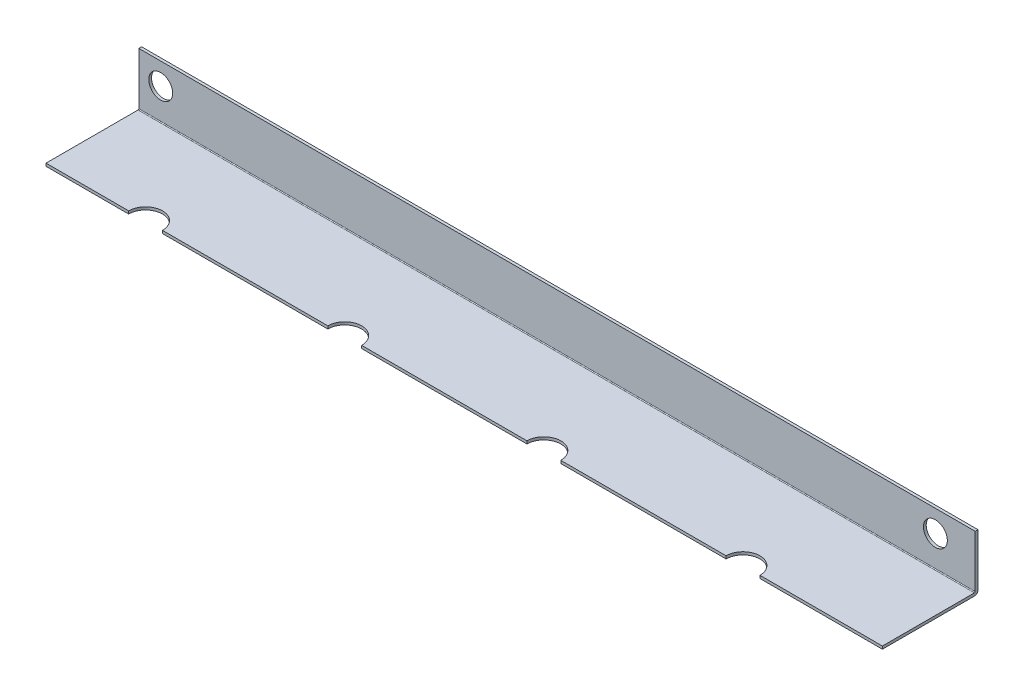
ISO-10303-21;
HEADER;
FILE_DESCRIPTION(('STEP AP214'),'2;1');
FILE_NAME('part.step','',(''),(''),'','','');
FILE_SCHEMA(('AUTOMOTIVE_DESIGN { 1 0 10303 214 1 1 1 1 }'));
ENDSEC;
DATA;
#1=APPLICATION_CONTEXT('core data for automotive mechanical design processes');
#2=APPLICATION_PROTOCOL_DEFINITION('international standard','automotive_design',2000,#1);
#3=PRODUCT_CONTEXT('',#1,'mechanical');
#4=PRODUCT('Part','Part','',(#3));
#5=PRODUCT_RELATED_PRODUCT_CATEGORY('part','',(#4));
#6=PRODUCT_DEFINITION_FORMATION('','',#4);
#7=PRODUCT_DEFINITION_CONTEXT('part definition',#1,'design');
#8=PRODUCT_DEFINITION('design','',#6,#7);
#9=PRODUCT_DEFINITION_SHAPE('','',#8);
#10=(LENGTH_UNIT() NAMED_UNIT(*) SI_UNIT(.MILLI.,.METRE.));
#11=(NAMED_UNIT(*) PLANE_ANGLE_UNIT() SI_UNIT($,.RADIAN.));
#12=(NAMED_UNIT(*) SI_UNIT($,.STERADIAN.) SOLID_ANGLE_UNIT());
#13=UNCERTAINTY_MEASURE_WITH_UNIT(LENGTH_MEASURE(1.E-05),#10,'distance_accuracy_value','');
#14=(GEOMETRIC_REPRESENTATION_CONTEXT(3) GLOBAL_UNCERTAINTY_ASSIGNED_CONTEXT((#13)) GLOBAL_UNIT_ASSIGNED_CONTEXT((#10,
#11,#12)) REPRESENTATION_CONTEXT('',''));
#15=CARTESIAN_POINT('',(0.,0.,0.));
#16=DIRECTION('',(0.,0.,1.));
#17=DIRECTION('',(1.,0.,0.));
#18=AXIS2_PLACEMENT_3D('',#15,#16,#17);
#19=CARTESIAN_POINT('',(-200.,13.31,-47.9999999999996));
#20=DIRECTION('',(0.,0.,-1.));
#21=DIRECTION('',(-1.,0.,0.));
#22=AXIS2_PLACEMENT_3D('',#19,#20,#21);
#23=PLANE('',#22);
#24=DIRECTION('',(-1.,0.,0.));
#25=VECTOR('',#24,1.);
#26=CARTESIAN_POINT('',(0.,0.,-47.9999999999996));
#27=LINE('',#26,#25);
#28=CARTESIAN_POINT('',(-179.25,0.,-47.9999999999996));
#29=VERTEX_POINT('',#28);
#30=CARTESIAN_POINT('',(-200.,0.,-47.9999999999996));
#31=VERTEX_POINT('',#30);
#32=EDGE_CURVE('E220',#29,#31,#27,.T.);
#33=ORIENTED_EDGE('',*,*,#32,.T.);
#34=DIRECTION('',(0.,-1.,0.));
#35=VECTOR('',#34,1.);
#36=CARTESIAN_POINT('',(-200.,-0.7,-47.9999999999996));
#37=LINE('',#36,#35);
#38=CARTESIAN_POINT('',(-200.,-0.7,-47.9999999999996));
#39=VERTEX_POINT('',#38);
#40=EDGE_CURVE('E174',#31,#39,#37,.T.);
#41=ORIENTED_EDGE('',*,*,#40,.T.);
#42=DIRECTION('',(-1.,0.,0.));
#43=VECTOR('',#42,1.);
#44=CARTESIAN_POINT('',(0.,-0.7,-47.9999999999996));
#45=LINE('',#44,#43);
#46=CARTESIAN_POINT('',(-179.25,-0.7,-47.9999999999996));
#47=VERTEX_POINT('',#46);
#48=EDGE_CURVE('E224',#47,#39,#45,.T.);
#49=ORIENTED_EDGE('',*,*,#48,.F.);
#50=DIRECTION('',(0.,1.,0.));
#51=VECTOR('',#50,1.);
#52=CARTESIAN_POINT('',(-179.25,-0.7,-47.9999999999996));
#53=LINE('',#52,#51);
#54=EDGE_CURVE('E225',#29,#47,#53,.F.);
#55=ORIENTED_EDGE('',*,*,#54,.F.);
#56=EDGE_LOOP('',(#33,#41,#49,#55));
#57=FACE_BOUND('',#56,.T.);
#58=ADVANCED_FACE('F36',(#57),#23,.F.);
#59=CARTESIAN_POINT('',(-129.25,-0.7,-47.9999999999996));
#60=VERTEX_POINT('',#59);
#61=CARTESIAN_POINT('',(-170.75,-0.7,-47.9999999999996));
#62=VERTEX_POINT('',#61);
#63=EDGE_CURVE('E310',#60,#62,#45,.T.);
#64=ORIENTED_EDGE('',*,*,#63,.F.);
#65=DIRECTION('',(0.,1.,0.));
#66=VECTOR('',#65,1.);
#67=CARTESIAN_POINT('',(-129.25,-0.7,-47.9999999999996));
#68=LINE('',#67,#66);
#69=CARTESIAN_POINT('',(-129.25,0.,-47.9999999999996));
#70=VERTEX_POINT('',#69);
#71=EDGE_CURVE('E229',#70,#60,#68,.F.);
#72=ORIENTED_EDGE('',*,*,#71,.F.);
#73=CARTESIAN_POINT('',(-170.75,0.,-47.9999999999996));
#74=VERTEX_POINT('',#73);
#75=EDGE_CURVE('E325',#70,#74,#27,.T.);
#76=ORIENTED_EDGE('',*,*,#75,.T.);
#77=DIRECTION('',(0.,1.,0.));
#78=VECTOR('',#77,1.);
#79=CARTESIAN_POINT('',(-170.75,-0.7,-47.9999999999996));
#80=LINE('',#79,#78);
#81=EDGE_CURVE('E227',#62,#74,#80,.T.);
#82=ORIENTED_EDGE('',*,*,#81,.F.);
#83=EDGE_LOOP('',(#64,#72,#76,#82));
#84=FACE_BOUND('',#83,.T.);
#85=ADVANCED_FACE('F337',(#84),#23,.F.);
#86=CARTESIAN_POINT('',(-79.2500000000001,-0.7,-47.9999999999996));
#87=VERTEX_POINT('',#86);
#88=CARTESIAN_POINT('',(-120.75,-0.7,-47.9999999999996));
#89=VERTEX_POINT('',#88);
#90=EDGE_CURVE('E308',#87,#89,#45,.T.);
#91=ORIENTED_EDGE('',*,*,#90,.F.);
#92=DIRECTION('',(0.,1.,0.));
#93=VECTOR('',#92,1.);
#94=CARTESIAN_POINT('',(-79.2500000000001,-0.7,-47.9999999999996));
#95=LINE('',#94,#93);
#96=CARTESIAN_POINT('',(-79.2500000000001,0.,-47.9999999999996));
#97=VERTEX_POINT('',#96);
#98=EDGE_CURVE('E237',#97,#87,#95,.F.);
#99=ORIENTED_EDGE('',*,*,#98,.F.);
#100=CARTESIAN_POINT('',(-120.75,0.,-47.9999999999996));
#101=VERTEX_POINT('',#100);
#102=EDGE_CURVE('E326',#97,#101,#27,.T.);
#103=ORIENTED_EDGE('',*,*,#102,.T.);
#104=DIRECTION('',(0.,1.,0.));
#105=VECTOR('',#104,1.);
#106=CARTESIAN_POINT('',(-120.75,-0.7,-47.9999999999996));
#107=LINE('',#106,#105);
#108=EDGE_CURVE('E231',#89,#101,#107,.T.);
#109=ORIENTED_EDGE('',*,*,#108,.F.);
#110=EDGE_LOOP('',(#91,#99,#103,#109));
#111=FACE_BOUND('',#110,.T.);
#112=ADVANCED_FACE('F334',(#111),#23,.F.);
#113=CARTESIAN_POINT('',(-29.2500000000001,0.,-47.9999999999996));
#114=VERTEX_POINT('',#113);
#115=CARTESIAN_POINT('',(-70.7500000000001,0.,-47.9999999999996));
#116=VERTEX_POINT('',#115);
#117=EDGE_CURVE('E181',#114,#116,#27,.T.);
#118=ORIENTED_EDGE('',*,*,#117,.T.);
#119=DIRECTION('',(0.,1.,0.));
#120=VECTOR('',#119,1.);
#121=CARTESIAN_POINT('',(-70.7500000000001,-0.7,-47.9999999999996));
#122=LINE('',#121,#120);
#123=CARTESIAN_POINT('',(-70.7500000000001,-0.7,-47.9999999999996));
#124=VERTEX_POINT('',#123);
#125=EDGE_CURVE('E239',#124,#116,#122,.T.);
#126=ORIENTED_EDGE('',*,*,#125,.F.);
#127=CARTESIAN_POINT('',(-29.2500000000001,-0.7,-47.9999999999996));
#128=VERTEX_POINT('',#127);
#129=EDGE_CURVE('E180',#128,#124,#45,.T.);
#130=ORIENTED_EDGE('',*,*,#129,.F.);
#131=DIRECTION('',(0.,1.,0.));
#132=VECTOR('',#131,1.);
#133=CARTESIAN_POINT('',(-29.2500000000001,-0.7,-47.9999999999996));
#134=LINE('',#133,#132);
#135=EDGE_CURVE('E233',#114,#128,#134,.F.);
#136=ORIENTED_EDGE('',*,*,#135,.F.);
#137=EDGE_LOOP('',(#118,#126,#130,#136));
#138=FACE_BOUND('',#137,.T.);
#139=ADVANCED_FACE('F306',(#138),#23,.F.);
#140=CARTESIAN_POINT('',(9.9999999999999,0.,-47.9999999999996));
#141=VERTEX_POINT('',#140);
#142=CARTESIAN_POINT('',(-20.75,0.,-47.9999999999996));
#143=VERTEX_POINT('',#142);
#144=EDGE_CURVE('E217',#141,#143,#27,.T.);
#145=ORIENTED_EDGE('',*,*,#144,.T.);
#146=DIRECTION('',(0.,1.,0.));
#147=VECTOR('',#146,1.);
#148=CARTESIAN_POINT('',(-20.75,-0.7,-47.9999999999996));
#149=LINE('',#148,#147);
#150=CARTESIAN_POINT('',(-20.75,-0.7,-47.9999999999996));
#151=VERTEX_POINT('',#150);
#152=EDGE_CURVE('E235',#151,#143,#149,.T.);
#153=ORIENTED_EDGE('',*,*,#152,.F.);
#154=CARTESIAN_POINT('',(9.9999999999999,-0.7,-47.9999999999996));
#155=VERTEX_POINT('',#154);
#156=EDGE_CURVE('E221',#155,#151,#45,.T.);
#157=ORIENTED_EDGE('',*,*,#156,.F.);
#158=DIRECTION('',(0.,-1.,0.));
#159=VECTOR('',#158,1.);
#160=CARTESIAN_POINT('',(9.9999999999999,13.31,-47.9999999999996));
#161=LINE('',#160,#159);
#162=EDGE_CURVE('E11',#141,#155,#161,.T.);
#163=ORIENTED_EDGE('',*,*,#162,.F.);
#164=EDGE_LOOP('',(#145,#153,#157,#163));
#165=FACE_BOUND('',#164,.T.);
#166=ADVANCED_FACE('F298',(#165),#23,.F.);
#167=CARTESIAN_POINT('',(9.9999999999999,13.31,-72.));
#168=DIRECTION('',(1.,0.,0.));
#169=DIRECTION('',(0.,0.,-1.));
#170=AXIS2_PLACEMENT_3D('',#167,#168,#169);
#171=PLANE('',#170);
#172=CARTESIAN_POINT('',(9.9999999999999,0.200000000000011,-71.1));
#173=DIRECTION('',(1.,0.,0.));
#174=DIRECTION('',(0.,0.,-1.));
#175=AXIS2_PLACEMENT_3D('',#172,#173,#174);
#176=CIRCLE('',#175,0.900000000000006);
#177=CARTESIAN_POINT('',(9.9999999999999,0.200000000000017,-72.));
#178=VERTEX_POINT('',#177);
#179=CARTESIAN_POINT('',(9.9999999999999,-0.699999999999995,-71.1));
#180=VERTEX_POINT('',#179);
#181=EDGE_CURVE('E166',#178,#180,#176,.F.);
#182=ORIENTED_EDGE('',*,*,#181,.F.);
#183=DIRECTION('',(0.,1.,0.));
#184=VECTOR('',#183,1.);
#185=CARTESIAN_POINT('',(9.9999999999999,-2.27827658477636E-13,-72.));
#186=LINE('',#185,#184);
#187=CARTESIAN_POINT('',(9.9999999999999,13.3,-72.0000000000001));
#188=VERTEX_POINT('',#187);
#189=EDGE_CURVE('E172',#178,#188,#186,.T.);
#190=ORIENTED_EDGE('',*,*,#189,.T.);
#191=DIRECTION('',(0.,0.,1.));
#192=VECTOR('',#191,1.);
#193=CARTESIAN_POINT('',(9.9999999999999,13.3,-72.));
#194=LINE('',#193,#192);
#195=CARTESIAN_POINT('',(9.9999999999999,13.3,-71.3));
#196=VERTEX_POINT('',#195);
#197=EDGE_CURVE('E40',#188,#196,#194,.T.);
#198=ORIENTED_EDGE('',*,*,#197,.T.);
#199=DIRECTION('',(0.,1.,0.));
#200=VECTOR('',#199,1.);
#201=CARTESIAN_POINT('',(9.9999999999999,-2.25383621540445E-13,-71.3));
#202=LINE('',#201,#200);
#203=CARTESIAN_POINT('',(9.9999999999999,0.200000000000012,-71.3));
#204=VERTEX_POINT('',#203);
#205=EDGE_CURVE('E159',#204,#196,#202,.T.);
#206=ORIENTED_EDGE('',*,*,#205,.F.);
#207=CARTESIAN_POINT('',(9.9999999999999,0.200000000000011,-71.1));
#208=DIRECTION('',(1.,0.,0.));
#209=DIRECTION('',(0.,0.,-1.));
#210=AXIS2_PLACEMENT_3D('',#207,#208,#209);
#211=CIRCLE('',#210,0.200000000000006);
#212=CARTESIAN_POINT('',(9.9999999999999,0.,-71.1));
#213=VERTEX_POINT('',#212);
#214=EDGE_CURVE('E173',#204,#213,#211,.F.);
#215=ORIENTED_EDGE('',*,*,#214,.T.);
#216=DIRECTION('',(0.,0.,-1.));
#217=VECTOR('',#216,1.);
#218=CARTESIAN_POINT('',(9.99999999999991,0.,0.));
#219=LINE('',#218,#217);
#220=EDGE_CURVE('E223',#141,#213,#219,.T.);
#221=ORIENTED_EDGE('',*,*,#220,.F.);
#222=ORIENTED_EDGE('',*,*,#162,.T.);
#223=DIRECTION('',(0.,0.,-1.));
#224=VECTOR('',#223,1.);
#225=CARTESIAN_POINT('',(9.99999999999991,-0.7,0.));
#226=LINE('',#225,#224);
#227=EDGE_CURVE('E177',#155,#180,#226,.T.);
#228=ORIENTED_EDGE('',*,*,#227,.T.);
#229=EDGE_LOOP('',(#182,#190,#198,#206,#215,#221,#222,#228));
#230=FACE_BOUND('',#229,.T.);
#231=ADVANCED_FACE('F170',(#230),#171,.T.);
#232=CARTESIAN_POINT('',(0.,-0.7,0.));
#233=DIRECTION('',(0.,1.,0.));
#234=DIRECTION('',(0.,0.,1.));
#235=AXIS2_PLACEMENT_3D('',#232,#233,#234);
#236=PLANE('',#235);
#237=CARTESIAN_POINT('',(-25.,-0.7,-48.));
#238=DIRECTION('',(0.,1.,0.));
#239=DIRECTION('',(0.,0.,-1.));
#240=AXIS2_PLACEMENT_3D('',#237,#238,#239);
#241=CIRCLE('',#240,4.25000000000001);
#242=EDGE_CURVE('E195',#151,#128,#241,.T.);
#243=ORIENTED_EDGE('',*,*,#242,.T.);
#244=ORIENTED_EDGE('',*,*,#129,.T.);
#245=CARTESIAN_POINT('',(-75.0000000000001,-0.7,-48.));
#246=DIRECTION('',(0.,1.,0.));
#247=DIRECTION('',(0.,0.,1.));
#248=AXIS2_PLACEMENT_3D('',#245,#246,#247);
#249=CIRCLE('',#248,4.25000000000001);
#250=EDGE_CURVE('E189',#124,#87,#249,.T.);
#251=ORIENTED_EDGE('',*,*,#250,.T.);
#252=ORIENTED_EDGE('',*,*,#90,.T.);
#253=CARTESIAN_POINT('',(-125.,-0.7,-48.));
#254=DIRECTION('',(0.,1.,0.));
#255=DIRECTION('',(0.,0.,-1.));
#256=AXIS2_PLACEMENT_3D('',#253,#254,#255);
#257=CIRCLE('',#256,4.25000000000001);
#258=EDGE_CURVE('E201',#89,#60,#257,.T.);
#259=ORIENTED_EDGE('',*,*,#258,.T.);
#260=ORIENTED_EDGE('',*,*,#63,.T.);
#261=CARTESIAN_POINT('',(-175.,-0.7,-48.));
#262=DIRECTION('',(0.,1.,0.));
#263=DIRECTION('',(0.,0.,1.));
#264=AXIS2_PLACEMENT_3D('',#261,#262,#263);
#265=CIRCLE('',#264,4.25000000000001);
#266=EDGE_CURVE('E207',#62,#47,#265,.T.);
#267=ORIENTED_EDGE('',*,*,#266,.T.);
#268=ORIENTED_EDGE('',*,*,#48,.T.);
#269=DIRECTION('',(0.,0.,1.));
#270=VECTOR('',#269,1.);
#271=CARTESIAN_POINT('',(-200.,-0.7,-72.));
#272=LINE('',#271,#270);
#273=CARTESIAN_POINT('',(-200.,-0.699999999999981,-71.1));
#274=VERTEX_POINT('',#273);
#275=EDGE_CURVE('E165',#274,#39,#272,.T.);
#276=ORIENTED_EDGE('',*,*,#275,.F.);
#277=DIRECTION('',(-1.,0.,0.));
#278=VECTOR('',#277,1.);
#279=CARTESIAN_POINT('',(-200.,-0.699999999999981,-71.1));
#280=LINE('',#279,#278);
#281=EDGE_CURVE('E257',#274,#180,#280,.F.);
#282=ORIENTED_EDGE('',*,*,#281,.T.);
#283=ORIENTED_EDGE('',*,*,#227,.F.);
#284=ORIENTED_EDGE('',*,*,#156,.T.);
#285=EDGE_LOOP('',(#243,#244,#251,#252,#259,#260,#267,#268,#276,#282,#283,#284));
#286=FACE_BOUND('',#285,.T.);
#287=ADVANCED_FACE('F279',(#286),#236,.F.);
#288=CARTESIAN_POINT('',(0.,0.,0.));
#289=DIRECTION('',(0.,1.,0.));
#290=DIRECTION('',(0.,0.,1.));
#291=AXIS2_PLACEMENT_3D('',#288,#289,#290);
#292=PLANE('',#291);
#293=ORIENTED_EDGE('',*,*,#117,.F.);
#294=CARTESIAN_POINT('',(-25.,0.,-48.));
#295=DIRECTION('',(0.,1.,0.));
#296=DIRECTION('',(0.,0.,-1.));
#297=AXIS2_PLACEMENT_3D('',#294,#295,#296);
#298=CIRCLE('',#297,4.25000000000001);
#299=EDGE_CURVE('E192',#143,#114,#298,.T.);
#300=ORIENTED_EDGE('',*,*,#299,.F.);
#301=ORIENTED_EDGE('',*,*,#144,.F.);
#302=ORIENTED_EDGE('',*,*,#220,.T.);
#303=DIRECTION('',(-1.,0.,0.));
#304=VECTOR('',#303,1.);
#305=CARTESIAN_POINT('',(-200.,0.,-71.1));
#306=LINE('',#305,#304);
#307=CARTESIAN_POINT('',(-200.,0.,-71.1));
#308=VERTEX_POINT('',#307);
#309=EDGE_CURVE('E261',#308,#213,#306,.F.);
#310=ORIENTED_EDGE('',*,*,#309,.F.);
#311=DIRECTION('',(0.,0.,1.));
#312=VECTOR('',#311,1.);
#313=CARTESIAN_POINT('',(-200.,0.,-72.));
#314=LINE('',#313,#312);
#315=EDGE_CURVE('E210',#308,#31,#314,.T.);
#316=ORIENTED_EDGE('',*,*,#315,.T.);
#317=ORIENTED_EDGE('',*,*,#32,.F.);
#318=CARTESIAN_POINT('',(-175.,0.,-48.));
#319=DIRECTION('',(0.,1.,0.));
#320=DIRECTION('',(0.,0.,1.));
#321=AXIS2_PLACEMENT_3D('',#318,#319,#320);
#322=CIRCLE('',#321,4.25000000000001);
#323=EDGE_CURVE('E204',#74,#29,#322,.T.);
#324=ORIENTED_EDGE('',*,*,#323,.F.);
#325=ORIENTED_EDGE('',*,*,#75,.F.);
#326=CARTESIAN_POINT('',(-125.,0.,-48.));
#327=DIRECTION('',(0.,1.,0.));
#328=DIRECTION('',(0.,0.,-1.));
#329=AXIS2_PLACEMENT_3D('',#326,#327,#328);
#330=CIRCLE('',#329,4.25000000000001);
#331=EDGE_CURVE('E198',#101,#70,#330,.T.);
#332=ORIENTED_EDGE('',*,*,#331,.F.);
#333=ORIENTED_EDGE('',*,*,#102,.F.);
#334=CARTESIAN_POINT('',(-75.0000000000001,0.,-48.));
#335=DIRECTION('',(0.,1.,0.));
#336=DIRECTION('',(0.,0.,1.));
#337=AXIS2_PLACEMENT_3D('',#334,#335,#336);
#338=CIRCLE('',#337,4.25000000000001);
#339=EDGE_CURVE('E185',#116,#97,#338,.T.);
#340=ORIENTED_EDGE('',*,*,#339,.F.);
#341=EDGE_LOOP('',(#293,#300,#301,#302,#310,#316,#317,#324,#325,#332,#333,#340));
#342=FACE_BOUND('',#341,.T.);
#343=ADVANCED_FACE('F294',(#342),#292,.T.);
#344=CARTESIAN_POINT('',(-200.,0.200000000000025,-71.1));
#345=DIRECTION('',(1.,0.,0.));
#346=DIRECTION('',(0.,1.,0.));
#347=AXIS2_PLACEMENT_3D('',#344,#345,#346);
#348=PLANE('',#347);
#349=CARTESIAN_POINT('',(-200.,0.200000000000025,-71.1));
#350=DIRECTION('',(-1.,0.,0.));
#351=DIRECTION('',(0.,-1.,0.));
#352=AXIS2_PLACEMENT_3D('',#349,#350,#351);
#353=CIRCLE('',#352,0.200000000000006);
#354=CARTESIAN_POINT('',(-200.,0.200000000000024,-71.3));
#355=VERTEX_POINT('',#354);
#356=EDGE_CURVE('E249',#355,#308,#353,.T.);
#357=ORIENTED_EDGE('',*,*,#356,.F.);
#358=DIRECTION('',(0.,0.,1.));
#359=VECTOR('',#358,1.);
#360=CARTESIAN_POINT('',(-200.,0.20000000000002,-71.3));
#361=LINE('',#360,#359);
#362=CARTESIAN_POINT('',(-200.,0.200000000000024,-72.));
#363=VERTEX_POINT('',#362);
#364=EDGE_CURVE('E184',#355,#363,#361,.F.);
#365=ORIENTED_EDGE('',*,*,#364,.T.);
#366=CARTESIAN_POINT('',(-200.,0.200000000000025,-71.1));
#367=DIRECTION('',(-1.,0.,0.));
#368=DIRECTION('',(0.,-1.,0.));
#369=AXIS2_PLACEMENT_3D('',#366,#367,#368);
#370=CIRCLE('',#369,0.900000000000006);
#371=EDGE_CURVE('E55',#363,#274,#370,.T.);
#372=ORIENTED_EDGE('',*,*,#371,.T.);
#373=DIRECTION('',(0.,-1.,0.));
#374=VECTOR('',#373,1.);
#375=CARTESIAN_POINT('',(-200.,0.,-71.1));
#376=LINE('',#375,#374);
#377=EDGE_CURVE('E188',#308,#274,#376,.T.);
#378=ORIENTED_EDGE('',*,*,#377,.F.);
#379=EDGE_LOOP('',(#357,#365,#372,#378));
#380=FACE_BOUND('',#379,.T.);
#381=ADVANCED_FACE('F287',(#380),#348,.F.);
#382=CARTESIAN_POINT('',(-200.,0.200000000000025,-71.1));
#383=DIRECTION('',(-1.,0.,0.));
#384=DIRECTION('',(0.,0.,-1.));
#385=AXIS2_PLACEMENT_3D('',#382,#383,#384);
#386=CYLINDRICAL_SURFACE('',#385,0.900000000000006);
#387=DIRECTION('',(-1.,0.,0.));
#388=VECTOR('',#387,1.);
#389=CARTESIAN_POINT('',(200.,0.200000000000011,-72.));
#390=LINE('',#389,#388);
#391=EDGE_CURVE('E254',#363,#178,#390,.F.);
#392=ORIENTED_EDGE('',*,*,#391,.T.);
#393=ORIENTED_EDGE('',*,*,#181,.T.);
#394=ORIENTED_EDGE('',*,*,#281,.F.);
#395=ORIENTED_EDGE('',*,*,#371,.F.);
#396=EDGE_LOOP('',(#392,#393,#394,#395));
#397=FACE_BOUND('',#396,.T.);
#398=ADVANCED_FACE('F273',(#397),#386,.T.);
#399=CARTESIAN_POINT('',(-200.,0.200000000000025,-71.1));
#400=DIRECTION('',(-1.,0.,0.));
#401=DIRECTION('',(0.,0.,-1.));
#402=AXIS2_PLACEMENT_3D('',#399,#400,#401);
#403=CYLINDRICAL_SURFACE('',#402,0.200000000000006);
#404=ORIENTED_EDGE('',*,*,#214,.F.);
#405=DIRECTION('',(-1.,0.,0.));
#406=VECTOR('',#405,1.);
#407=CARTESIAN_POINT('',(200.,0.200000000000006,-71.3));
#408=LINE('',#407,#406);
#409=EDGE_CURVE('E161',#204,#355,#408,.T.);
#410=ORIENTED_EDGE('',*,*,#409,.T.);
#411=ORIENTED_EDGE('',*,*,#356,.T.);
#412=ORIENTED_EDGE('',*,*,#309,.T.);
#413=EDGE_LOOP('',(#404,#410,#411,#412));
#414=FACE_BOUND('',#413,.T.);
#415=ADVANCED_FACE('F290',(#414),#403,.F.);
#416=CARTESIAN_POINT('',(0.,7.80000000000007,-62.));
#417=DIRECTION('',(0.,0.,-1.));
#418=DIRECTION('',(0.,1.,0.));
#419=AXIS2_PLACEMENT_3D('',#416,#417,#418);
#420=CYLINDRICAL_SURFACE('',#419,3.);
#421=CARTESIAN_POINT('',(0.,7.80000000000004,-71.3));
#422=DIRECTION('',(0.,0.,1.));
#423=DIRECTION('',(0.,-1.,0.));
#424=AXIS2_PLACEMENT_3D('',#421,#422,#423);
#425=CIRCLE('',#424,3.);
#426=CARTESIAN_POINT('',(0.,4.80000000000004,-71.3));
#427=VERTEX_POINT('',#426);
#428=EDGE_CURVE('E183',#427,#427,#425,.T.);
#429=ORIENTED_EDGE('',*,*,#428,.T.);
#430=EDGE_LOOP('',(#429));
#431=FACE_BOUND('',#430,.T.);
#432=CARTESIAN_POINT('',(0.,7.80000000000004,-72.));
#433=DIRECTION('',(0.,0.,-1.));
#434=DIRECTION('',(0.,1.,0.));
#435=AXIS2_PLACEMENT_3D('',#432,#433,#434);
#436=CIRCLE('',#435,3.);
#437=CARTESIAN_POINT('',(0.,10.8,-72.0000000000001));
#438=VERTEX_POINT('',#437);
#439=EDGE_CURVE('E241',#438,#438,#436,.T.);
#440=ORIENTED_EDGE('',*,*,#439,.T.);
#441=EDGE_LOOP('',(#440));
#442=FACE_BOUND('',#441,.T.);
#443=ADVANCED_FACE('F473',(#431,#442),#420,.F.);
#444=CARTESIAN_POINT('',(-194.5,7.80000000000008,-62.));
#445=DIRECTION('',(0.,0.,-1.));
#446=DIRECTION('',(0.,1.,0.));
#447=AXIS2_PLACEMENT_3D('',#444,#445,#446);
#448=CYLINDRICAL_SURFACE('',#447,2.99999999999999);
#449=CARTESIAN_POINT('',(-194.5,7.80000000000005,-71.3));
#450=DIRECTION('',(0.,0.,1.));
#451=DIRECTION('',(0.,-1.,0.));
#452=AXIS2_PLACEMENT_3D('',#449,#450,#451);
#453=CIRCLE('',#452,2.99999999999999);
#454=CARTESIAN_POINT('',(-194.5,4.80000000000006,-71.3));
#455=VERTEX_POINT('',#454);
#456=EDGE_CURVE('E244',#455,#455,#453,.T.);
#457=ORIENTED_EDGE('',*,*,#456,.T.);
#458=EDGE_LOOP('',(#457));
#459=FACE_BOUND('',#458,.T.);
#460=CARTESIAN_POINT('',(-194.5,7.80000000000005,-72.));
#461=DIRECTION('',(0.,0.,-1.));
#462=DIRECTION('',(0.,-1.,0.));
#463=AXIS2_PLACEMENT_3D('',#460,#461,#462);
#464=CIRCLE('',#463,2.99999999999999);
#465=CARTESIAN_POINT('',(-194.5,4.80000000000005,-72.));
#466=VERTEX_POINT('',#465);
#467=EDGE_CURVE('E46',#466,#466,#464,.T.);
#468=ORIENTED_EDGE('',*,*,#467,.T.);
#469=EDGE_LOOP('',(#468));
#470=FACE_BOUND('',#469,.T.);
#471=ADVANCED_FACE('F462',(#459,#470),#448,.F.);
#472=CARTESIAN_POINT('',(0.,-2.25383621540445E-13,-71.3));
#473=DIRECTION('',(0.,0.,1.));
#474=DIRECTION('',(0.,-1.,0.));
#475=AXIS2_PLACEMENT_3D('',#472,#473,#474);
#476=PLANE('',#475);
#477=ORIENTED_EDGE('',*,*,#456,.F.);
#478=EDGE_LOOP('',(#477));
#479=FACE_BOUND('',#478,.T.);
#480=ORIENTED_EDGE('',*,*,#428,.F.);
#481=EDGE_LOOP('',(#480));
#482=FACE_BOUND('',#481,.T.);
#483=ORIENTED_EDGE('',*,*,#409,.F.);
#484=ORIENTED_EDGE('',*,*,#205,.T.);
#485=DIRECTION('',(-1.,0.,0.));
#486=VECTOR('',#485,1.);
#487=CARTESIAN_POINT('',(200.,13.3,-71.3));
#488=LINE('',#487,#486);
#489=CARTESIAN_POINT('',(-200.,13.3,-71.3));
#490=VERTEX_POINT('',#489);
#491=EDGE_CURVE('E147',#490,#196,#488,.F.);
#492=ORIENTED_EDGE('',*,*,#491,.F.);
#493=DIRECTION('',(0.,-1.,0.));
#494=VECTOR('',#493,1.);
#495=CARTESIAN_POINT('',(-200.,13.3,-71.3));
#496=LINE('',#495,#494);
#497=EDGE_CURVE('E155',#355,#490,#496,.F.);
#498=ORIENTED_EDGE('',*,*,#497,.F.);
#499=EDGE_LOOP('',(#483,#484,#492,#498));
#500=FACE_BOUND('',#499,.T.);
#501=ADVANCED_FACE('F160',(#479,#482,#500),#476,.T.);
#502=CARTESIAN_POINT('',(-200.,13.3,-72.0000000000001));
#503=DIRECTION('',(1.,0.,0.));
#504=DIRECTION('',(0.,0.,-1.));
#505=AXIS2_PLACEMENT_3D('',#502,#503,#504);
#506=PLANE('',#505);
#507=ORIENTED_EDGE('',*,*,#364,.F.);
#508=ORIENTED_EDGE('',*,*,#497,.T.);
#509=DIRECTION('',(0.,0.,1.));
#510=VECTOR('',#509,1.);
#511=CARTESIAN_POINT('',(-200.,13.3,-72.0000000000001));
#512=LINE('',#511,#510);
#513=CARTESIAN_POINT('',(-200.,13.3,-72.0000000000001));
#514=VERTEX_POINT('',#513);
#515=EDGE_CURVE('E152',#514,#490,#512,.T.);
#516=ORIENTED_EDGE('',*,*,#515,.F.);
#517=DIRECTION('',(0.,1.,0.));
#518=VECTOR('',#517,1.);
#519=CARTESIAN_POINT('',(-200.,-2.27827658477636E-13,-72.));
#520=LINE('',#519,#518);
#521=EDGE_CURVE('E156',#363,#514,#520,.T.);
#522=ORIENTED_EDGE('',*,*,#521,.F.);
#523=EDGE_LOOP('',(#507,#508,#516,#522));
#524=FACE_BOUND('',#523,.T.);
#525=ADVANCED_FACE('F442',(#524),#506,.F.);
#526=CARTESIAN_POINT('',(0.,-2.27827658477636E-13,-72.));
#527=DIRECTION('',(0.,0.,1.));
#528=DIRECTION('',(0.,-1.,0.));
#529=AXIS2_PLACEMENT_3D('',#526,#527,#528);
#530=PLANE('',#529);
#531=ORIENTED_EDGE('',*,*,#439,.F.);
#532=EDGE_LOOP('',(#531));
#533=FACE_BOUND('',#532,.T.);
#534=ORIENTED_EDGE('',*,*,#467,.F.);
#535=EDGE_LOOP('',(#534));
#536=FACE_BOUND('',#535,.T.);
#537=ORIENTED_EDGE('',*,*,#189,.F.);
#538=ORIENTED_EDGE('',*,*,#391,.F.);
#539=ORIENTED_EDGE('',*,*,#521,.T.);
#540=DIRECTION('',(1.,0.,0.));
#541=VECTOR('',#540,1.);
#542=CARTESIAN_POINT('',(0.,13.3,-72.0000000000001));
#543=LINE('',#542,#541);
#544=EDGE_CURVE('E248',#514,#188,#543,.T.);
#545=ORIENTED_EDGE('',*,*,#544,.T.);
#546=EDGE_LOOP('',(#537,#538,#539,#545));
#547=FACE_BOUND('',#546,.T.);
#548=ADVANCED_FACE('F433',(#533,#536,#547),#530,.F.);
#549=CARTESIAN_POINT('',(200.,13.3,-72.0000000000001));
#550=DIRECTION('',(0.,-1.,0.));
#551=DIRECTION('',(0.,0.,-1.));
#552=AXIS2_PLACEMENT_3D('',#549,#550,#551);
#553=PLANE('',#552);
#554=ORIENTED_EDGE('',*,*,#197,.F.);
#555=ORIENTED_EDGE('',*,*,#544,.F.);
#556=ORIENTED_EDGE('',*,*,#515,.T.);
#557=ORIENTED_EDGE('',*,*,#491,.T.);
#558=EDGE_LOOP('',(#554,#555,#556,#557));
#559=FACE_BOUND('',#558,.T.);
#560=ADVANCED_FACE('F38',(#559),#553,.F.);
#561=CARTESIAN_POINT('',(-75.0000000000001,-0.7,-48.));
#562=DIRECTION('',(0.,1.,0.));
#563=DIRECTION('',(0.,0.,1.));
#564=AXIS2_PLACEMENT_3D('',#561,#562,#563);
#565=CYLINDRICAL_SURFACE('',#564,4.25000000000001);
#566=ORIENTED_EDGE('',*,*,#339,.T.);
#567=ORIENTED_EDGE('',*,*,#98,.T.);
#568=ORIENTED_EDGE('',*,*,#250,.F.);
#569=ORIENTED_EDGE('',*,*,#125,.T.);
#570=EDGE_LOOP('',(#566,#567,#568,#569));
#571=FACE_BOUND('',#570,.T.);
#572=ADVANCED_FACE('F333',(#571),#565,.F.);
#573=CARTESIAN_POINT('',(-25.,-0.7,-48.));
#574=DIRECTION('',(0.,1.,0.));
#575=DIRECTION('',(0.,0.,1.));
#576=AXIS2_PLACEMENT_3D('',#573,#574,#575);
#577=CYLINDRICAL_SURFACE('',#576,4.25000000000001);
#578=ORIENTED_EDGE('',*,*,#299,.T.);
#579=ORIENTED_EDGE('',*,*,#135,.T.);
#580=ORIENTED_EDGE('',*,*,#242,.F.);
#581=ORIENTED_EDGE('',*,*,#152,.T.);
#582=EDGE_LOOP('',(#578,#579,#580,#581));
#583=FACE_BOUND('',#582,.T.);
#584=ADVANCED_FACE('F303',(#583),#577,.F.);
#585=CARTESIAN_POINT('',(-125.,-0.7,-48.));
#586=DIRECTION('',(0.,1.,0.));
#587=DIRECTION('',(0.,0.,1.));
#588=AXIS2_PLACEMENT_3D('',#585,#586,#587);
#589=CYLINDRICAL_SURFACE('',#588,4.25000000000001);
#590=ORIENTED_EDGE('',*,*,#331,.T.);
#591=ORIENTED_EDGE('',*,*,#71,.T.);
#592=ORIENTED_EDGE('',*,*,#258,.F.);
#593=ORIENTED_EDGE('',*,*,#108,.T.);
#594=EDGE_LOOP('',(#590,#591,#592,#593));
#595=FACE_BOUND('',#594,.T.);
#596=ADVANCED_FACE('F336',(#595),#589,.F.);
#597=CARTESIAN_POINT('',(-175.,-0.7,-48.));
#598=DIRECTION('',(0.,1.,0.));
#599=DIRECTION('',(0.,0.,1.));
#600=AXIS2_PLACEMENT_3D('',#597,#598,#599);
#601=CYLINDRICAL_SURFACE('',#600,4.25000000000001);
#602=ORIENTED_EDGE('',*,*,#323,.T.);
#603=ORIENTED_EDGE('',*,*,#54,.T.);
#604=ORIENTED_EDGE('',*,*,#266,.F.);
#605=ORIENTED_EDGE('',*,*,#81,.T.);
#606=EDGE_LOOP('',(#602,#603,#604,#605));
#607=FACE_BOUND('',#606,.T.);
#608=ADVANCED_FACE('F319',(#607),#601,.F.);
#609=CARTESIAN_POINT('',(-200.,-0.7,-72.));
#610=DIRECTION('',(-1.,0.,0.));
#611=DIRECTION('',(0.,0.,1.));
#612=AXIS2_PLACEMENT_3D('',#609,#610,#611);
#613=PLANE('',#612);
#614=ORIENTED_EDGE('',*,*,#40,.F.);
#615=ORIENTED_EDGE('',*,*,#315,.F.);
#616=ORIENTED_EDGE('',*,*,#377,.T.);
#617=ORIENTED_EDGE('',*,*,#275,.T.);
#618=EDGE_LOOP('',(#614,#615,#616,#617));
#619=FACE_BOUND('',#618,.T.);
#620=ADVANCED_FACE('F284',(#619),#613,.T.);
#621=CLOSED_SHELL('',(#58,#85,#112,#139,#166,#231,#287,#343,#381,#398,#415,#443,#471,#501,#525,
#548,#560,#572,#584,#596,#608,#620));
#622=MANIFOLD_SOLID_BREP('B2',#621);
#623=ADVANCED_BREP_SHAPE_REPRESENTATION('',(#18,#622),#14);
#624=SHAPE_DEFINITION_REPRESENTATION(#9,#623);
ENDSEC;
END-ISO-10303-21;
